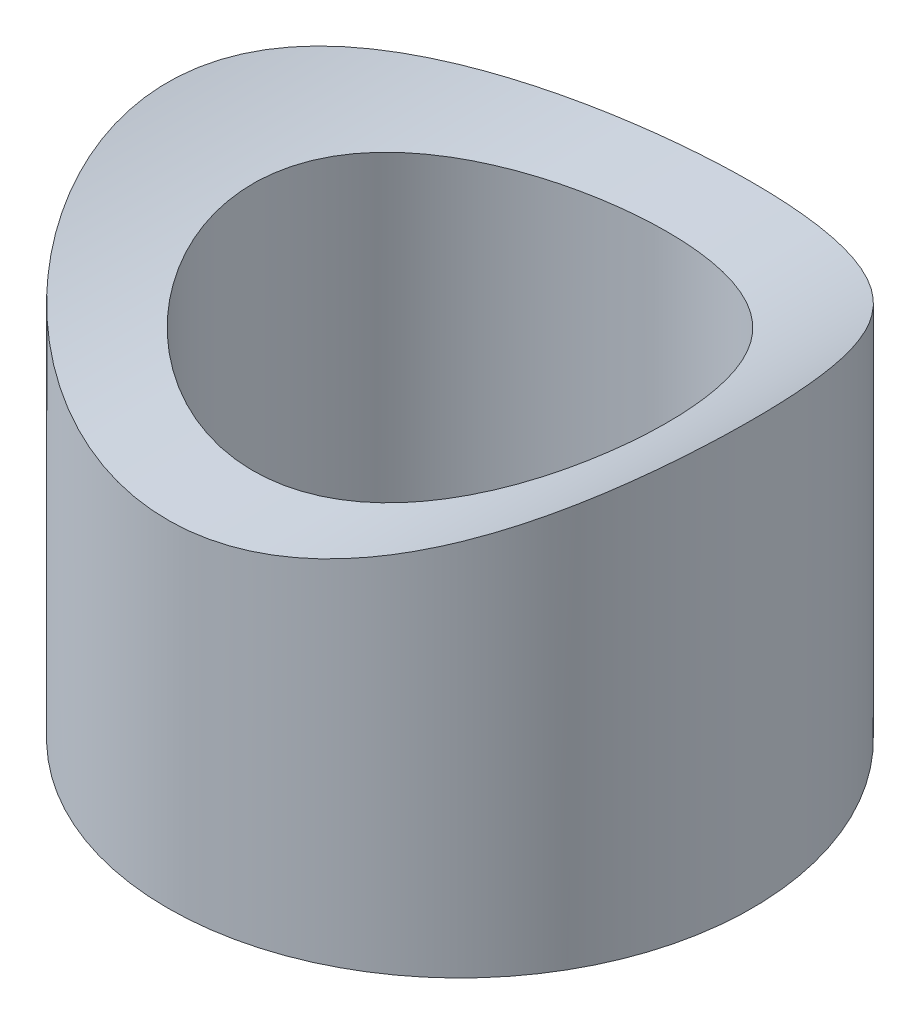
ISO-10303-21;
HEADER;
FILE_DESCRIPTION(('STEP AP214'),'2;1');
FILE_NAME('part.step','',(''),(''),'','','');
FILE_SCHEMA(('AUTOMOTIVE_DESIGN { 1 0 10303 214 1 1 1 1 }'));
ENDSEC;
DATA;
#1=APPLICATION_CONTEXT('core data for automotive mechanical design processes');
#2=APPLICATION_PROTOCOL_DEFINITION('international standard','automotive_design',2000,#1);
#3=PRODUCT_CONTEXT('',#1,'mechanical');
#4=PRODUCT('Part','Part','',(#3));
#5=PRODUCT_RELATED_PRODUCT_CATEGORY('part','',(#4));
#6=PRODUCT_DEFINITION_FORMATION('','',#4);
#7=PRODUCT_DEFINITION_CONTEXT('part definition',#1,'design');
#8=PRODUCT_DEFINITION('design','',#6,#7);
#9=PRODUCT_DEFINITION_SHAPE('','',#8);
#10=(LENGTH_UNIT() NAMED_UNIT(*) SI_UNIT(.MILLI.,.METRE.));
#11=(NAMED_UNIT(*) PLANE_ANGLE_UNIT() SI_UNIT($,.RADIAN.));
#12=(NAMED_UNIT(*) SI_UNIT($,.STERADIAN.) SOLID_ANGLE_UNIT());
#13=UNCERTAINTY_MEASURE_WITH_UNIT(LENGTH_MEASURE(1.E-05),#10,'distance_accuracy_value','');
#14=(GEOMETRIC_REPRESENTATION_CONTEXT(3) GLOBAL_UNCERTAINTY_ASSIGNED_CONTEXT((#13)) GLOBAL_UNIT_ASSIGNED_CONTEXT((#10,
#11,#12)) REPRESENTATION_CONTEXT('',''));
#15=CARTESIAN_POINT('',(0.,0.,0.));
#16=DIRECTION('',(0.,0.,1.));
#17=DIRECTION('',(1.,0.,0.));
#18=AXIS2_PLACEMENT_3D('',#15,#16,#17);
#19=CARTESIAN_POINT('',(0.,0.,0.));
#20=DIRECTION('',(0.,1.,0.));
#21=DIRECTION('',(0.,0.,1.));
#22=AXIS2_PLACEMENT_3D('',#19,#20,#21);
#23=PLANE('',#22);
#24=CARTESIAN_POINT('',(0.,0.,0.));
#25=DIRECTION('',(0.,1.,0.));
#26=DIRECTION('',(0.,0.,1.));
#27=AXIS2_PLACEMENT_3D('',#24,#25,#26);
#28=CIRCLE('',#27,6.);
#29=CARTESIAN_POINT('',(0.,0.,6.));
#30=VERTEX_POINT('',#29);
#31=EDGE_CURVE('E10',#30,#30,#28,.T.);
#32=ORIENTED_EDGE('',*,*,#31,.F.);
#33=EDGE_LOOP('',(#32));
#34=FACE_BOUND('',#33,.T.);
#35=CARTESIAN_POINT('',(0.,0.,0.));
#36=DIRECTION('',(0.,1.,0.));
#37=DIRECTION('',(0.,0.,1.));
#38=AXIS2_PLACEMENT_3D('',#35,#36,#37);
#39=CIRCLE('',#38,4.25);
#40=CARTESIAN_POINT('',(0.,0.,4.25));
#41=VERTEX_POINT('',#40);
#42=EDGE_CURVE('E45',#41,#41,#39,.T.);
#43=ORIENTED_EDGE('',*,*,#42,.T.);
#44=EDGE_LOOP('',(#43));
#45=FACE_BOUND('',#44,.T.);
#46=ADVANCED_FACE('F31',(#34,#45),#23,.F.);
#47=CARTESIAN_POINT('',(0.,6.9,0.));
#48=DIRECTION('',(0.,-1.,0.));
#49=DIRECTION('',(0.,0.,-1.));
#50=AXIS2_PLACEMENT_3D('',#47,#48,#49);
#51=CYLINDRICAL_SURFACE('',#50,6.);
#52=ORIENTED_EDGE('',*,*,#31,.T.);
#53=EDGE_LOOP('',(#52));
#54=FACE_BOUND('',#53,.T.);
#55=CARTESIAN_POINT('',(0.,6.9,-6.));
#56=CARTESIAN_POINT('',(0.156010380218778,6.89999881324574,-6.00000134983509));
#57=CARTESIAN_POINT('',(0.312004559571418,6.90332555041542,-5.99390944810248));
#58=CARTESIAN_POINT('',(0.622821349435728,6.91654477486767,-5.96962266071581));
#59=CARTESIAN_POINT('',(0.77764358369895,6.9264392872285,-5.95142404212727));
#60=CARTESIAN_POINT('',(1.08503168774858,6.95255615268274,-5.90312955034074));
#61=CARTESIAN_POINT('',(1.23759514472952,6.96878482770165,-5.87302179060465));
#62=CARTESIAN_POINT('',(1.53927854292847,7.0071694307043,-5.80126501973647));
#63=CARTESIAN_POINT('',(1.68839705085895,7.0293277791733,-5.75961129530684));
#64=CARTESIAN_POINT('',(1.98148978568079,7.07892422453072,-5.66544586670793));
#65=CARTESIAN_POINT('',(2.12548439990932,7.10633774135959,-5.61298463055033));
#66=CARTESIAN_POINT('',(2.40823749774219,7.16588100310043,-5.49761237312002));
#67=CARTESIAN_POINT('',(2.54699395073089,7.19801255386765,-5.43469734937977));
#68=CARTESIAN_POINT('',(2.95417573750218,7.30042723396287,-5.23113518276352));
#69=CARTESIAN_POINT('',(3.21380265930007,7.37678143193777,-5.07557694057067));
#70=CARTESIAN_POINT('',(3.72135467352237,7.54490619267805,-4.71748380586468));
#71=CARTESIAN_POINT('',(3.96728059545666,7.63737231979737,-4.51247219364193));
#72=CARTESIAN_POINT('',(4.42327099947603,7.82550291063181,-4.06649300180342));
#73=CARTESIAN_POINT('',(4.63330253808541,7.92117021709979,-3.82549276823535));
#74=CARTESIAN_POINT('',(4.92743173601606,8.06465938191488,-3.42799397383836));
#75=CARTESIAN_POINT('',(5.02558641097119,8.11458949229752,-3.28244361605656));
#76=CARTESIAN_POINT('',(5.2092388524023,8.21111073023403,-2.98240688651633));
#77=CARTESIAN_POINT('',(5.29473393467977,8.25770114859967,-2.82791862929484));
#78=CARTESIAN_POINT('',(5.45221590337264,8.34586508962765,-2.51090794394252));
#79=CARTESIAN_POINT('',(5.5242081397387,8.3874405969034,-2.34838873013394));
#80=CARTESIAN_POINT('',(5.65386779187449,8.46392835831446,-2.0163126912196));
#81=CARTESIAN_POINT('',(5.71154438842503,8.4988448795865,-1.84676045833159));
#82=CARTESIAN_POINT('',(5.80864821925492,8.55855190664357,-1.512597958077));
#83=CARTESIAN_POINT('',(5.84899249182809,8.58383981013486,-1.34834371740417));
#84=CARTESIAN_POINT('',(5.91578625806913,8.62610959902469,-1.01597034106037));
#85=CARTESIAN_POINT('',(5.94223646272575,8.64309190943488,-0.847851403613706));
#86=CARTESIAN_POINT('',(5.98074958747023,8.66792749027455,-0.509500315379748));
#87=CARTESIAN_POINT('',(5.99282955349531,8.67579157643533,-0.339270910815358));
#88=CARTESIAN_POINT('',(6.00242316325914,8.68203088683814,0.00176200151853));
#89=CARTESIAN_POINT('',(5.99993873459277,8.68040736676314,0.17256543032561));
#90=CARTESIAN_POINT('',(5.98191968133109,8.66870979794881,0.487519980665225));
#91=CARTESIAN_POINT('',(5.96839049368883,8.65993467995633,0.631840060132331));
#92=CARTESIAN_POINT('',(5.9310219425023,8.63590406681241,0.918638470789212));
#93=CARTESIAN_POINT('',(5.90717927313534,8.62064649384094,1.06111619634812));
#94=CARTESIAN_POINT('',(5.84948068651707,8.58416739272444,1.34324371706968));
#95=CARTESIAN_POINT('',(5.81562500819578,8.5629460068883,1.48289357962575));
#96=CARTESIAN_POINT('',(5.73828127403671,8.51521515125273,1.75859522071805));
#97=CARTESIAN_POINT('',(5.69478938191521,8.48870357578904,1.89464554202168));
#98=CARTESIAN_POINT('',(5.54840735768835,8.40114101600621,2.30206796601449));
#99=CARTESIAN_POINT('',(5.43083546337332,8.33287816989389,2.56677772398212));
#100=CARTESIAN_POINT('',(5.16078236858729,8.18454856672231,3.0739342764768));
#101=CARTESIAN_POINT('',(5.0082859687122,8.10447667569689,3.31637131319363));
#102=CARTESIAN_POINT('',(4.64530299012663,7.92663215364941,3.8117533463972));
#103=CARTESIAN_POINT('',(4.42949409908801,7.82803802334939,4.06051718291802));
#104=CARTESIAN_POINT('',(3.95912475261352,7.63403992005402,4.52033788236384));
#105=CARTESIAN_POINT('',(3.70453879242252,7.53863809747202,4.73136972785049));
#106=CARTESIAN_POINT('',(3.28839795102184,7.40191700896588,5.02171407543704));
#107=CARTESIAN_POINT('',(3.13890064602277,7.3561426063562,5.11652450615821));
#108=CARTESIAN_POINT('',(2.83107937271896,7.26936002962828,5.29305466907341));
#109=CARTESIAN_POINT('',(2.6727592120756,7.22834982264869,5.37477999029837));
#110=CARTESIAN_POINT('',(2.34836093730029,7.15230489134332,5.52422695822923));
#111=CARTESIAN_POINT('',(2.18228670552386,7.11726721667055,5.59195552266823));
#112=CARTESIAN_POINT('',(1.84354705614787,7.05421775041062,5.71258615436735));
#113=CARTESIAN_POINT('',(1.67088256315043,7.02620497738641,5.76549029284413));
#114=CARTESIAN_POINT('',(1.33662060016194,6.98032836712242,5.85153178886072));
#115=CARTESIAN_POINT('',(1.17547152943016,6.96176669382213,5.88604238866895));
#116=CARTESIAN_POINT('',(0.85024442242985,6.93169376007176,5.94174163388856));
#117=CARTESIAN_POINT('',(0.686166716490647,6.92018170958151,5.9629317721102));
#118=CARTESIAN_POINT('',(0.356552227327945,6.90454270118879,5.99167977376556));
#119=CARTESIAN_POINT('',(0.191016205867506,6.90041209359377,5.9992443742469));
#120=CARTESIAN_POINT('',(-0.140126765363353,6.89964676408397,6.00064771966249));
#121=CARTESIAN_POINT('',(-0.305733710048481,6.90301157323065,5.99448732327885));
#122=CARTESIAN_POINT('',(-0.619685996075284,6.91645505681476,5.96978655147064));
#123=CARTESIAN_POINT('',(-0.768160609650149,6.92585737681559,5.95249292696585));
#124=CARTESIAN_POINT('',(-1.06298195485852,6.95048150307988,5.90697236070747));
#125=CARTESIAN_POINT('',(-1.20932800996612,6.96570511932587,5.87874201842655));
#126=CARTESIAN_POINT('',(-1.49882837026134,7.0016154980087,5.81167666627185));
#127=CARTESIAN_POINT('',(-1.64198367774183,7.02230051788912,5.77284503878948));
#128=CARTESIAN_POINT('',(-1.92434061755461,7.06868451072477,5.68496151512241));
#129=CARTESIAN_POINT('',(-2.06354068367648,7.0943854390528,5.63590563266496));
#130=CARTESIAN_POINT('',(-2.34029670381352,7.15088825565143,5.52681031393797));
#131=CARTESIAN_POINT('',(-2.47774316593271,7.18179291041367,5.46654634346901));
#132=CARTESIAN_POINT('',(-2.74699015162996,7.24761604066405,5.33633113306379));
#133=CARTESIAN_POINT('',(-2.87878875080985,7.28253586954932,5.26637662509583));
#134=CARTESIAN_POINT('',(-3.26476472144362,7.39225444374846,5.04278336711018));
#135=CARTESIAN_POINT('',(-3.50967812338597,7.47204533464164,4.87535285120676));
#136=CARTESIAN_POINT('',(-3.99637377262803,7.64801436692218,4.48735310489324));
#137=CARTESIAN_POINT('',(-4.2348014550356,7.74502863087324,4.26295133233608));
#138=CARTESIAN_POINT('',(-4.56279609920368,7.890240390348,3.89969092817037));
#139=CARTESIAN_POINT('',(-4.66726239403441,7.93863356615667,3.77404340449847));
#140=CARTESIAN_POINT('',(-4.86585945667947,8.03412285906242,3.51427517900057));
#141=CARTESIAN_POINT('',(-4.95998842512441,8.08121874928169,3.38015300841346));
#142=CARTESIAN_POINT('',(-5.14398543823588,8.17626938983748,3.09362990570814));
#143=CARTESIAN_POINT('',(-5.23300033576277,8.22402225448894,2.94061292046666));
#144=CARTESIAN_POINT('',(-5.3976022814505,8.31486957394933,2.62627921148824));
#145=CARTESIAN_POINT('',(-5.47319576872188,8.35796625871969,2.46496651590353));
#146=CARTESIAN_POINT('',(-5.61011988585908,8.43782067954982,2.13504589005054));
#147=CARTESIAN_POINT('',(-5.67146350728874,8.47458418158871,1.96644477230831));
#148=CARTESIAN_POINT('',(-5.77911642709941,8.54020303898106,1.62301468179838));
#149=CARTESIAN_POINT('',(-5.82542850439967,8.56905985590934,1.44818686681553));
#150=CARTESIAN_POINT('',(-5.89849985977065,8.61509948655448,1.111073596683));
#151=CARTESIAN_POINT('',(-5.92672327755863,8.6331450436826,0.94922312387004));
#152=CARTESIAN_POINT('',(-5.96983033883941,8.66085560319295,0.623040229877403));
#153=CARTESIAN_POINT('',(-5.98471496488025,8.6705212228476,0.458707992413757));
#154=CARTESIAN_POINT('',(-6.00087462156953,8.68101970156583,0.129205502108778));
#155=CARTESIAN_POINT('',(-6.00215898676364,8.68185861883836,-0.0359640980998001));
#156=CARTESIAN_POINT('',(-5.99111876600506,8.67467942928014,-0.365643602650858));
#157=CARTESIAN_POINT('',(-5.97879523629572,8.66666200987727,-0.530153557200279));
#158=CARTESIAN_POINT('',(-5.94328523507579,8.64377311774441,-0.835302700585594));
#159=CARTESIAN_POINT('',(-5.92175407726491,8.62995032074063,-0.976217119857881));
#160=CARTESIAN_POINT('',(-5.86889658464932,8.59639745444159,-1.25549903234124));
#161=CARTESIAN_POINT('',(-5.83756709798958,8.57666548441345,-1.39386569082064));
#162=CARTESIAN_POINT('',(-5.72938151883696,8.50950026240444,-1.80387323593705));
#163=CARTESIAN_POINT('',(-5.63830782150066,8.45408363099319,-2.07059340848859));
#164=CARTESIAN_POINT('',(-5.4148240728697,8.3241309839543,-2.6015149451212));
#165=CARTESIAN_POINT('',(-5.28019375975312,8.24861953361974,-2.86452596787747));
#166=CARTESIAN_POINT('',(-4.97556130675081,8.08809482226304,-3.36600275091685));
#167=CARTESIAN_POINT('',(-4.80554027713383,8.00307649822518,-3.60445530114664));
#168=CARTESIAN_POINT('',(-4.40438664743186,7.81747951333307,-4.08834750173523));
#169=CARTESIAN_POINT('',(-4.16787953629006,7.71651552003728,-4.32924146819371));
#170=CARTESIAN_POINT('',(-3.78428175841514,7.57052385582514,-4.65915947365728));
#171=CARTESIAN_POINT('',(-3.65147825676881,7.52272882339573,-4.76397442833725));
#172=CARTESIAN_POINT('',(-3.37681739619679,7.43013563590787,-4.96243602174723));
#173=CARTESIAN_POINT('',(-3.23496401158851,7.38533618278403,-5.05608751185906));
#174=CARTESIAN_POINT('',(-2.93814833741048,7.29849208390784,-5.23433108123826));
#175=CARTESIAN_POINT('',(-2.7829100612056,7.25658396880345,-5.31853066571782));
#176=CARTESIAN_POINT('',(-2.4645236252108,7.17838760334356,-5.47333848294959));
#177=CARTESIAN_POINT('',(-2.30137939976762,7.1420965946259,-5.54395339082055));
#178=CARTESIAN_POINT('',(-1.96859017914496,7.07625935475533,-5.67065136959227));
#179=CARTESIAN_POINT('',(-1.79895853082072,7.04670006303303,-5.72676260891567));
#180=CARTESIAN_POINT('',(-1.45437089246495,6.9951785180598,-5.82381519818775));
#181=CARTESIAN_POINT('',(-1.27941778931166,6.97321222286671,-5.86476461998006));
#182=CARTESIAN_POINT('',(-0.921489666383701,6.93715497840684,-5.93167656518369));
#183=CARTESIAN_POINT('',(-0.738422843804483,6.92326442374644,-5.95725822013056));
#184=CARTESIAN_POINT('',(-0.370229737680023,6.90468766405999,-5.99141908968346));
#185=CARTESIAN_POINT('',(-0.185103465545343,6.90000140806224,-5.99999839844533));
#186=CARTESIAN_POINT('',(0.,6.9,-6.));
#187=B_SPLINE_CURVE_WITH_KNOTS('',3,(#55,#56,#57,#58,#59,#60,#61,#62,#63,#64,#65,#66,#67,#68,
#69,#70,#71,#72,#73,#74,#75,#76,#77,#78,#79,#80,#81,#82,#83,#84,#85,#86,#87,#88,#89,#90,#91,#92,
#93,#94,#95,#96,#97,#98,#99,#100,#101,#102,#103,#104,#105,#106,#107,#108,#109,#110,#111,#112,
#113,#114,#115,#116,#117,#118,#119,#120,#121,#122,#123,#124,#125,#126,#127,#128,#129,#130,#131,
#132,#133,#134,#135,#136,#137,#138,#139,#140,#141,#142,#143,#144,#145,#146,#147,#148,#149,#150,
#151,#152,#153,#154,#155,#156,#157,#158,#159,#160,#161,#162,#163,#164,#165,#166,#167,#168,#169,
#170,#171,#172,#173,#174,#175,#176,#177,#178,#179,#180,#181,#182,#183,#184,#185,#186),
.UNSPECIFIED.,.T.,.F.,(4,2,2,2,2,2,2,2,2,2,2,2,2,2,2,2,2,2,2,2,2,2,2,2,2,2,2,2,2,2,2,2,2,2,2,2,
2,2,2,2,2,2,2,2,2,2,2,2,2,2,2,2,2,2,2,2,2,2,2,2,2,2,2,2,2,4),(0.,0.467849935218514,
0.935844192231595,1.4043067387238,1.87296080350504,2.33947407371538,2.80616637234366,
3.7386365094306,4.73457273663132,5.73141817090803,6.27839563054588,6.82548889961226,
7.37236494530868,7.91888936176189,8.43116917972949,8.94342278070467,9.45506814004492,
9.96664578474799,10.4017831829853,10.8370601610759,11.2723267534426,11.7077669426335,
12.5967862145221,13.4861931319294,14.5132563146127,15.5409979658638,16.088921380662,
16.6366101334719,17.1840275467241,17.7313684385618,18.2282185415645,18.7250129531619,
19.2215616608925,19.7180793037334,20.16687638924,20.6158131302846,21.0646068029447,
21.5135757814725,21.9727612583813,22.4321019694667,23.3502759115363,24.3701982294013,
24.8810255638417,25.3919416751106,25.9412903992819,26.4903748492668,27.0389567183384,
27.5874371118611,28.0825450438569,28.5776165027347,29.0723481470327,29.5670413930124,
29.996201126335,30.4254990508672,31.2835804485513,32.1950771288312,33.1070615720913,
34.159031842221,34.6859580158281,35.2126543582437,35.7564385748988,36.2999549053209,
36.8424075719157,37.3845710310683,37.9396695048048,38.4947649044998),.UNSPECIFIED.);
#188=CARTESIAN_POINT('',(0.,6.9,-6.));
#189=VERTEX_POINT('',#188);
#190=EDGE_CURVE('E49',#189,#189,#187,.T.);
#191=ORIENTED_EDGE('',*,*,#190,.T.);
#192=EDGE_LOOP('',(#191));
#193=FACE_BOUND('',#192,.T.);
#194=ADVANCED_FACE('F33',(#54,#193),#51,.T.);
#195=CARTESIAN_POINT('',(0.,6.9,0.));
#196=DIRECTION('',(0.,-1.,0.));
#197=DIRECTION('',(0.,0.,-1.));
#198=AXIS2_PLACEMENT_3D('',#195,#196,#197);
#199=CYLINDRICAL_SURFACE('',#198,4.25);
#200=CARTESIAN_POINT('',(0.,6.9,-4.25));
#201=CARTESIAN_POINT('',(0.11480159499447,6.89999951089521,-4.25000063072264));
#202=CARTESIAN_POINT('',(0.229593977188016,6.90180111210806,-4.24534470849002));
#203=CARTESIAN_POINT('',(0.458352562104915,6.90895766496992,-4.22677011368757));
#204=CARTESIAN_POINT('',(0.57231850036046,6.91431370737384,-4.21284859777197));
#205=CARTESIAN_POINT('',(0.798481586221714,6.9284344805968,-4.17588832345352));
#206=CARTESIAN_POINT('',(0.910679743416667,6.93719718656544,-4.15285498078964));
#207=CARTESIAN_POINT('',(1.13259426854802,6.9578939723115,-4.09790445874087));
#208=CARTESIAN_POINT('',(1.2423096527927,6.96982928602588,-4.06598382255043));
#209=CARTESIAN_POINT('',(1.56606398679203,7.0098915529257,-3.95746849885117));
#210=CARTESIAN_POINT('',(1.77541826204168,7.04232183032182,-3.86800316653339));
#211=CARTESIAN_POINT('',(2.17600436757597,7.11544493685221,-3.65770339595109));
#212=CARTESIAN_POINT('',(2.3672310178924,7.15614011730579,-3.53686002807755));
#213=CARTESIAN_POINT('',(2.73481760279231,7.24364598673568,-3.26160905780353));
#214=CARTESIAN_POINT('',(2.91026892264653,7.29063693656,-3.10604592988033));
#215=CARTESIAN_POINT('',(3.23338700599321,7.38460290211896,-2.76809160711051));
#216=CARTESIAN_POINT('',(3.38104448777518,7.43157790731984,-2.58569148619201));
#217=CARTESIAN_POINT('',(3.58152574312851,7.49913767587334,-2.29130847438373));
#218=CARTESIAN_POINT('',(3.64589937201521,7.52158664616844,-2.18743865922562));
#219=CARTESIAN_POINT('',(3.76561332342418,7.5644209919049,-1.97422922531905));
#220=CARTESIAN_POINT('',(3.82095728412577,7.58480719719927,-1.86489183284853));
#221=CARTESIAN_POINT('',(3.92214559079261,7.62285544322585,-1.64143927964524));
#222=CARTESIAN_POINT('',(3.96798899510869,7.64051721388096,-1.52732364666253));
#223=CARTESIAN_POINT('',(4.04970954151387,7.67249886514769,-1.29517705017278));
#224=CARTESIAN_POINT('',(4.08559157132664,7.68682038415911,-1.17714803877225));
#225=CARTESIAN_POINT('',(4.14571823517336,7.71108313565114,-0.943127036889542));
#226=CARTESIAN_POINT('',(4.1703932781245,7.72118489466125,-0.827262251718957));
#227=CARTESIAN_POINT('',(4.20999985022145,7.73750219250594,-0.593656823604872));
#228=CARTESIAN_POINT('',(4.22493570165503,7.74371945524245,-0.475917036593395));
#229=CARTESIAN_POINT('',(4.24490569681907,7.75204978650453,-0.239475642478779));
#230=CARTESIAN_POINT('',(4.2499415784155,7.75416357536355,-0.120774207859897));
#231=CARTESIAN_POINT('',(4.25005741127678,7.75421211364791,0.116629913554349));
#232=CARTESIAN_POINT('',(4.24513778265847,7.75214703941886,0.235332600085498));
#233=CARTESIAN_POINT('',(4.22603603239822,7.74417805453743,0.464147995152423));
#234=CARTESIAN_POINT('',(4.21247113353379,7.73853006011448,0.574321382314839));
#235=CARTESIAN_POINT('',(4.17682355988124,7.723826651105,0.793060992819968));
#236=CARTESIAN_POINT('',(4.1547380670677,7.71477010923009,0.90162667209552));
#237=CARTESIAN_POINT('',(4.07599041043722,7.68287703578555,1.2237449642432));
#238=CARTESIAN_POINT('',(4.00682017658639,7.65530942463966,1.43391674147394));
#239=CARTESIAN_POINT('',(3.83586559194647,7.59007358107617,1.84362841348292));
#240=CARTESIAN_POINT('',(3.73346796370849,7.55221778189131,2.04287879670104));
#241=CARTESIAN_POINT('',(3.49937375797414,7.47072755162726,2.42209607817005));
#242=CARTESIAN_POINT('',(3.36766664004838,7.42709104395049,2.60205600450301));
#243=CARTESIAN_POINT('',(3.06758854790932,7.33514288076228,2.951118207369));
#244=CARTESIAN_POINT('',(2.89726602519751,7.28672033356083,3.11851716244926));
#245=CARTESIAN_POINT('',(2.53042535976893,7.19333205351286,3.42290212009766));
#246=CARTESIAN_POINT('',(2.33390269011778,7.14836692016966,3.55988285599376));
#247=CARTESIAN_POINT('',(1.91568068639215,7.06596533046874,3.80157468660443));
#248=CARTESIAN_POINT('',(1.69360430509554,7.02867273023182,3.90568589873726));
#249=CARTESIAN_POINT('',(1.23328638839778,6.96689398208777,4.07449648851114));
#250=CARTESIAN_POINT('',(0.995052552370283,6.94240178228722,4.13921449322997));
#251=CARTESIAN_POINT('',(0.523487005713585,6.91006488149776,4.22405196068623));
#252=CARTESIAN_POINT('',(0.290625675304288,6.90136613572088,4.2464622049889));
#253=CARTESIAN_POINT('',(-0.17566773724543,6.89893421419545,4.25276038811569));
#254=CARTESIAN_POINT('',(-0.409099670224626,6.90519747423411,4.23665750144353));
#255=CARTESIAN_POINT('',(-0.859792929938975,6.93142401447499,4.16810308965218));
#256=CARTESIAN_POINT('',(-1.07732393134417,6.95081076020798,4.11718033705098));
#257=CARTESIAN_POINT('',(-1.50058014579559,7.00074740556822,3.98247462934884));
#258=CARTESIAN_POINT('',(-1.70630382500167,7.0312987517616,3.89868741598823));
#259=CARTESIAN_POINT('',(-2.10703370077399,7.10171034093356,3.69792377325615));
#260=CARTESIAN_POINT('',(-2.30153325992064,7.14182234216488,3.58002712275584));
#261=CARTESIAN_POINT('',(-2.66865564949624,7.22695692148022,3.31542226327348));
#262=CARTESIAN_POINT('',(-2.84127002883907,7.27198138412777,3.16870297968712));
#263=CARTESIAN_POINT('',(-3.17086360371613,7.36544891377358,2.83999414248929));
#264=CARTESIAN_POINT('',(-3.32622378383856,7.41393166727805,2.6563882596481));
#265=CARTESIAN_POINT('',(-3.60428292456257,7.50621975121052,2.26479826035612));
#266=CARTESIAN_POINT('',(-3.72697792676629,7.55002451437029,2.05681119376444));
#267=CARTESIAN_POINT('',(-3.93662107504575,7.62791807793104,1.62004239631129));
#268=CARTESIAN_POINT('',(-4.02333239276831,7.66194206940191,1.39113463168893));
#269=CARTESIAN_POINT('',(-4.15636224300905,7.71521298850632,0.920270954067977));
#270=CARTESIAN_POINT('',(-4.20270789202875,7.7344698352441,0.678323916678389));
#271=CARTESIAN_POINT('',(-4.25119059425952,7.75465607540574,0.205912476920764));
#272=CARTESIAN_POINT('',(-4.2561103394836,7.75673888345683,-0.0242191595849211));
#273=CARTESIAN_POINT('',(-4.22881105643373,7.74532750482729,-0.481852879197859));
#274=CARTESIAN_POINT('',(-4.19659602265228,7.7318349935434,-0.709355242470705));
#275=CARTESIAN_POINT('',(-4.09815657314919,7.69177945963672,-1.14729173004624));
#276=CARTESIAN_POINT('',(-4.03314049698325,7.6656821430357,-1.35804379608292));
#277=CARTESIAN_POINT('',(-3.8720407110134,7.60365517722205,-1.76575358637328));
#278=CARTESIAN_POINT('',(-3.77594893033461,7.56772297409951,-1.96270771088833));
#279=CARTESIAN_POINT('',(-3.54932982531261,7.48763130480349,-2.3489546348918));
#280=CARTESIAN_POINT('',(-3.41720706325671,7.44312944029284,-2.53723987475158));
#281=CARTESIAN_POINT('',(-3.12472203442773,7.35203388599566,-2.88983702965143));
#282=CARTESIAN_POINT('',(-2.96435051834177,7.30543951480709,-3.05414106035457));
#283=CARTESIAN_POINT('',(-2.608502168965,7.21209340522557,-3.36407372864248));
#284=CARTESIAN_POINT('',(-2.41151478504809,7.16549378399569,-3.50803423233408));
#285=CARTESIAN_POINT('',(-2.09900321013906,7.10159328424686,-3.6975131726136));
#286=CARTESIAN_POINT('',(-1.99191590118211,7.08128121126913,-3.75629336430975));
#287=CARTESIAN_POINT('',(-1.77272527061936,7.04321471449166,-3.86456464956033));
#288=CARTESIAN_POINT('',(-1.66062406566848,7.0254592245211,-3.91405961795135));
#289=CARTESIAN_POINT('',(-1.42416841446573,6.99188435154084,-4.00642835301781));
#290=CARTESIAN_POINT('',(-1.29950569482177,6.9762877001773,-4.04859549043406));
#291=CARTESIAN_POINT('',(-1.04644843669233,6.94914946486029,-4.12125758164161));
#292=CARTESIAN_POINT('',(-0.918055596754872,6.93760606560808,-4.15175776117176));
#293=CARTESIAN_POINT('',(-0.658704068641662,6.91897056867513,-4.20071666040167));
#294=CARTESIAN_POINT('',(-0.527745977881912,6.91187744699449,-4.21917815021815));
#295=CARTESIAN_POINT('',(-0.264521050057765,6.90239279575857,-4.24381853877933));
#296=CARTESIAN_POINT('',(-0.132254411581447,6.90000056346139,-4.24999927339118));
#297=CARTESIAN_POINT('',(0.,6.9,-4.25));
#298=B_SPLINE_CURVE_WITH_KNOTS('',3,(#200,#201,#202,#203,#204,#205,#206,#207,#208,#209,#210,
#211,#212,#213,#214,#215,#216,#217,#218,#219,#220,#221,#222,#223,#224,#225,#226,#227,#228,#229,
#230,#231,#232,#233,#234,#235,#236,#237,#238,#239,#240,#241,#242,#243,#244,#245,#246,#247,#248,
#249,#250,#251,#252,#253,#254,#255,#256,#257,#258,#259,#260,#261,#262,#263,#264,#265,#266,#267,
#268,#269,#270,#271,#272,#273,#274,#275,#276,#277,#278,#279,#280,#281,#282,#283,#284,#285,#286,
#287,#288,#289,#290,#291,#292,#293,#294,#295,#296,#297),.UNSPECIFIED.,.T.,.F.,(4,2,2,2,2,2,2,2,
2,2,2,2,2,2,2,2,2,2,2,2,2,2,2,2,2,2,2,2,2,2,2,2,2,2,2,2,2,2,2,2,2,2,2,2,2,2,2,2,4),(0.,
0.344280149593686,0.688665997664038,1.03284746209158,1.3771629869673,2.06366625150116,
2.75036509670429,3.46471333422736,4.17929970567715,4.55164809970271,4.92384609688484,
5.29608096690625,5.66813286922088,6.02434519684461,6.38039932838186,6.73639095168553,
7.09236755265981,7.42540793854858,7.75855856580626,8.42427087543969,9.10304479831588,
9.78206322097862,10.5097612225957,11.2375851212489,11.9780125817573,12.7180896586175,
13.4167973274016,14.1153385683355,14.7850280682756,15.4548043687976,16.144672843882,
16.8348069094303,17.5674699226561,18.3002216803239,19.0377223898897,19.7747272846053,
20.4617944805971,21.1487877774369,21.8121429136007,22.4756704726212,23.1754743729835,
23.8755078331271,24.6167391677171,24.9878582428309,25.3588220992436,25.7557703905001,
26.1525406761554,26.5492196322533,26.9458392837998),.UNSPECIFIED.);
#299=CARTESIAN_POINT('',(0.,6.9,-4.25));
#300=VERTEX_POINT('',#299);
#301=EDGE_CURVE('E36',#300,#300,#298,.T.);
#302=ORIENTED_EDGE('',*,*,#301,.F.);
#303=EDGE_LOOP('',(#302));
#304=FACE_BOUND('',#303,.T.);
#305=ORIENTED_EDGE('',*,*,#42,.F.);
#306=EDGE_LOOP('',(#305));
#307=FACE_BOUND('',#306,.T.);
#308=ADVANCED_FACE('F59',(#304,#307),#199,.F.);
#309=CARTESIAN_POINT('',(0.,17.9,-6.));
#310=DIRECTION('',(0.,0.,1.));
#311=DIRECTION('',(1.,0.,0.));
#312=AXIS2_PLACEMENT_3D('',#309,#310,#311);
#313=CYLINDRICAL_SURFACE('',#312,11.);
#314=ORIENTED_EDGE('',*,*,#301,.T.);
#315=EDGE_LOOP('',(#314));
#316=FACE_BOUND('',#315,.T.);
#317=ORIENTED_EDGE('',*,*,#190,.F.);
#318=EDGE_LOOP('',(#317));
#319=FACE_BOUND('',#318,.T.);
#320=ADVANCED_FACE('F56',(#316,#319),#313,.F.);
#321=CLOSED_SHELL('',(#46,#194,#308,#320));
#322=MANIFOLD_SOLID_BREP('B2',#321);
#323=ADVANCED_BREP_SHAPE_REPRESENTATION('',(#18,#322),#14);
#324=SHAPE_DEFINITION_REPRESENTATION(#9,#323);
ENDSEC;
END-ISO-10303-21;
